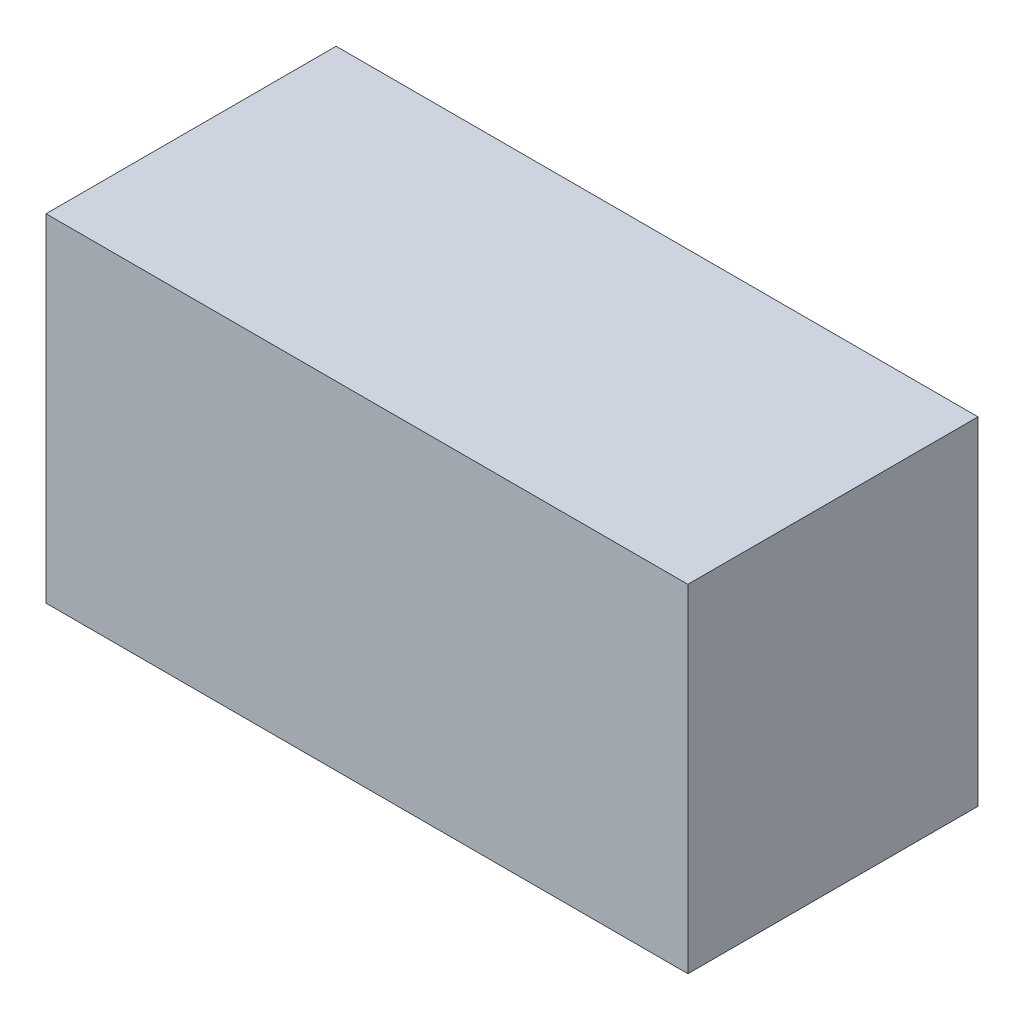
ISO-10303-21;
HEADER;
FILE_DESCRIPTION(('STEP AP214'),'2;1');
FILE_NAME('part.step','',(''),(''),'','','');
FILE_SCHEMA(('AUTOMOTIVE_DESIGN { 1 0 10303 214 1 1 1 1 }'));
ENDSEC;
DATA;
#1=APPLICATION_CONTEXT('core data for automotive mechanical design processes');
#2=APPLICATION_PROTOCOL_DEFINITION('international standard','automotive_design',2000,#1);
#3=PRODUCT_CONTEXT('',#1,'mechanical');
#4=PRODUCT('Part','Part','',(#3));
#5=PRODUCT_RELATED_PRODUCT_CATEGORY('part','',(#4));
#6=PRODUCT_DEFINITION_FORMATION('','',#4);
#7=PRODUCT_DEFINITION_CONTEXT('part definition',#1,'design');
#8=PRODUCT_DEFINITION('design','',#6,#7);
#9=PRODUCT_DEFINITION_SHAPE('','',#8);
#10=(LENGTH_UNIT() NAMED_UNIT(*) SI_UNIT(.MILLI.,.METRE.));
#11=(NAMED_UNIT(*) PLANE_ANGLE_UNIT() SI_UNIT($,.RADIAN.));
#12=(NAMED_UNIT(*) SI_UNIT($,.STERADIAN.) SOLID_ANGLE_UNIT());
#13=UNCERTAINTY_MEASURE_WITH_UNIT(LENGTH_MEASURE(1.E-05),#10,'distance_accuracy_value','');
#14=(GEOMETRIC_REPRESENTATION_CONTEXT(3) GLOBAL_UNCERTAINTY_ASSIGNED_CONTEXT((#13)) GLOBAL_UNIT_ASSIGNED_CONTEXT((#10,
#11,#12)) REPRESENTATION_CONTEXT('',''));
#15=CARTESIAN_POINT('',(0.,0.,0.));
#16=DIRECTION('',(0.,0.,1.));
#17=DIRECTION('',(1.,0.,0.));
#18=AXIS2_PLACEMENT_3D('',#15,#16,#17);
#19=CARTESIAN_POINT('',(0.015,0.005,0.8));
#20=DIRECTION('',(0.,0.,1.));
#21=DIRECTION('',(1.,0.,0.));
#22=AXIS2_PLACEMENT_3D('',#19,#20,#21);
#23=PLANE('',#22);
#24=DIRECTION('',(1.,0.,0.));
#25=VECTOR('',#24,1.);
#26=CARTESIAN_POINT('',(-0.87,-0.46,0.8));
#27=LINE('',#26,#25);
#28=CARTESIAN_POINT('',(-0.87,-0.46,0.8));
#29=VERTEX_POINT('',#28);
#30=CARTESIAN_POINT('',(0.9,-0.46,0.8));
#31=VERTEX_POINT('',#30);
#32=EDGE_CURVE('E96',#29,#31,#27,.T.);
#33=ORIENTED_EDGE('',*,*,#32,.T.);
#34=DIRECTION('',(0.,1.,0.));
#35=VECTOR('',#34,1.);
#36=CARTESIAN_POINT('',(0.9,-0.46,0.8));
#37=LINE('',#36,#35);
#38=CARTESIAN_POINT('',(0.9,0.47,0.8));
#39=VERTEX_POINT('',#38);
#40=EDGE_CURVE('E65',#31,#39,#37,.T.);
#41=ORIENTED_EDGE('',*,*,#40,.T.);
#42=DIRECTION('',(-1.,0.,0.));
#43=VECTOR('',#42,1.);
#44=CARTESIAN_POINT('',(0.9,0.47,0.8));
#45=LINE('',#44,#43);
#46=CARTESIAN_POINT('',(-0.87,0.47,0.8));
#47=VERTEX_POINT('',#46);
#48=EDGE_CURVE('E84',#39,#47,#45,.T.);
#49=ORIENTED_EDGE('',*,*,#48,.T.);
#50=DIRECTION('',(0.,-1.,0.));
#51=VECTOR('',#50,1.);
#52=CARTESIAN_POINT('',(-0.87,0.47,0.8));
#53=LINE('',#52,#51);
#54=EDGE_CURVE('E11',#47,#29,#53,.T.);
#55=ORIENTED_EDGE('',*,*,#54,.T.);
#56=EDGE_LOOP('',(#33,#41,#49,#55));
#57=FACE_BOUND('',#56,.T.);
#58=ADVANCED_FACE('F16',(#57),#23,.T.);
#59=CARTESIAN_POINT('',(0.015,0.005,0.));
#60=DIRECTION('',(0.,0.,1.));
#61=DIRECTION('',(1.,0.,0.));
#62=AXIS2_PLACEMENT_3D('',#59,#60,#61);
#63=PLANE('',#62);
#64=DIRECTION('',(1.,0.,0.));
#65=VECTOR('',#64,1.);
#66=CARTESIAN_POINT('',(-0.87,-0.46,0.));
#67=LINE('',#66,#65);
#68=CARTESIAN_POINT('',(-0.87,-0.46,0.));
#69=VERTEX_POINT('',#68);
#70=CARTESIAN_POINT('',(0.9,-0.46,0.));
#71=VERTEX_POINT('',#70);
#72=EDGE_CURVE('E87',#69,#71,#67,.T.);
#73=ORIENTED_EDGE('',*,*,#72,.F.);
#74=DIRECTION('',(0.,-1.,0.));
#75=VECTOR('',#74,1.);
#76=CARTESIAN_POINT('',(-0.87,0.47,0.));
#77=LINE('',#76,#75);
#78=CARTESIAN_POINT('',(-0.87,0.47,0.));
#79=VERTEX_POINT('',#78);
#80=EDGE_CURVE('E25',#79,#69,#77,.T.);
#81=ORIENTED_EDGE('',*,*,#80,.F.);
#82=DIRECTION('',(-1.,0.,0.));
#83=VECTOR('',#82,1.);
#84=CARTESIAN_POINT('',(0.9,0.47,0.));
#85=LINE('',#84,#83);
#86=CARTESIAN_POINT('',(0.9,0.47,0.));
#87=VERTEX_POINT('',#86);
#88=EDGE_CURVE('E19',#87,#79,#85,.T.);
#89=ORIENTED_EDGE('',*,*,#88,.F.);
#90=DIRECTION('',(0.,1.,0.));
#91=VECTOR('',#90,1.);
#92=CARTESIAN_POINT('',(0.9,-0.46,0.));
#93=LINE('',#92,#91);
#94=EDGE_CURVE('E73',#71,#87,#93,.T.);
#95=ORIENTED_EDGE('',*,*,#94,.F.);
#96=EDGE_LOOP('',(#73,#81,#89,#95));
#97=FACE_BOUND('',#96,.T.);
#98=ADVANCED_FACE('F88',(#97),#63,.F.);
#99=CARTESIAN_POINT('',(-0.87,0.47,0.));
#100=DIRECTION('',(1.,0.,0.));
#101=DIRECTION('',(0.,1.,0.));
#102=AXIS2_PLACEMENT_3D('',#99,#100,#101);
#103=PLANE('',#102);
#104=DIRECTION('',(0.,0.,1.));
#105=VECTOR('',#104,1.);
#106=CARTESIAN_POINT('',(-0.87,0.47,0.));
#107=LINE('',#106,#105);
#108=EDGE_CURVE('E81',#79,#47,#107,.T.);
#109=ORIENTED_EDGE('',*,*,#108,.F.);
#110=ORIENTED_EDGE('',*,*,#80,.T.);
#111=DIRECTION('',(0.,0.,1.));
#112=VECTOR('',#111,1.);
#113=CARTESIAN_POINT('',(-0.87,-0.46,0.));
#114=LINE('',#113,#112);
#115=EDGE_CURVE('E79',#69,#29,#114,.T.);
#116=ORIENTED_EDGE('',*,*,#115,.T.);
#117=ORIENTED_EDGE('',*,*,#54,.F.);
#118=EDGE_LOOP('',(#109,#110,#116,#117));
#119=FACE_BOUND('',#118,.T.);
#120=ADVANCED_FACE('F77',(#119),#103,.F.);
#121=CARTESIAN_POINT('',(0.9,0.47,0.));
#122=DIRECTION('',(0.,-1.,0.));
#123=DIRECTION('',(0.,0.,-1.));
#124=AXIS2_PLACEMENT_3D('',#121,#122,#123);
#125=PLANE('',#124);
#126=DIRECTION('',(0.,0.,1.));
#127=VECTOR('',#126,1.);
#128=CARTESIAN_POINT('',(0.9,0.47,0.));
#129=LINE('',#128,#127);
#130=EDGE_CURVE('E108',#87,#39,#129,.T.);
#131=ORIENTED_EDGE('',*,*,#130,.F.);
#132=ORIENTED_EDGE('',*,*,#88,.T.);
#133=ORIENTED_EDGE('',*,*,#108,.T.);
#134=ORIENTED_EDGE('',*,*,#48,.F.);
#135=EDGE_LOOP('',(#131,#132,#133,#134));
#136=FACE_BOUND('',#135,.T.);
#137=ADVANCED_FACE('F120',(#136),#125,.F.);
#138=CARTESIAN_POINT('',(0.9,-0.46,0.));
#139=DIRECTION('',(-1.,0.,0.));
#140=DIRECTION('',(0.,0.,1.));
#141=AXIS2_PLACEMENT_3D('',#138,#139,#140);
#142=PLANE('',#141);
#143=DIRECTION('',(0.,0.,1.));
#144=VECTOR('',#143,1.);
#145=CARTESIAN_POINT('',(0.9,-0.46,0.));
#146=LINE('',#145,#144);
#147=EDGE_CURVE('E92',#71,#31,#146,.T.);
#148=ORIENTED_EDGE('',*,*,#147,.F.);
#149=ORIENTED_EDGE('',*,*,#94,.T.);
#150=ORIENTED_EDGE('',*,*,#130,.T.);
#151=ORIENTED_EDGE('',*,*,#40,.F.);
#152=EDGE_LOOP('',(#148,#149,#150,#151));
#153=FACE_BOUND('',#152,.T.);
#154=ADVANCED_FACE('F121',(#153),#142,.F.);
#155=CARTESIAN_POINT('',(-0.87,-0.46,0.));
#156=DIRECTION('',(0.,1.,0.));
#157=DIRECTION('',(1.,0.,0.));
#158=AXIS2_PLACEMENT_3D('',#155,#156,#157);
#159=PLANE('',#158);
#160=ORIENTED_EDGE('',*,*,#115,.F.);
#161=ORIENTED_EDGE('',*,*,#72,.T.);
#162=ORIENTED_EDGE('',*,*,#147,.T.);
#163=ORIENTED_EDGE('',*,*,#32,.F.);
#164=EDGE_LOOP('',(#160,#161,#162,#163));
#165=FACE_BOUND('',#164,.T.);
#166=ADVANCED_FACE('F95',(#165),#159,.F.);
#167=CLOSED_SHELL('',(#58,#98,#120,#137,#154,#166));
#168=MANIFOLD_SOLID_BREP('B1',#167);
#169=ADVANCED_BREP_SHAPE_REPRESENTATION('',(#18,#168),#14);
#170=SHAPE_DEFINITION_REPRESENTATION(#9,#169);
ENDSEC;
END-ISO-10303-21;
